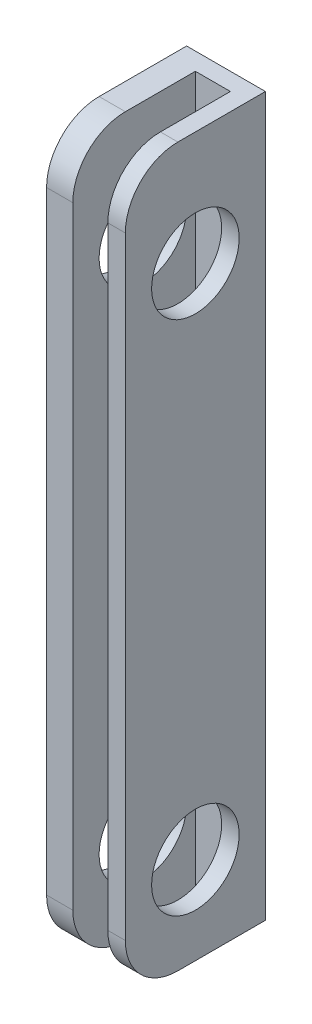
ISO-10303-21;
HEADER;
FILE_DESCRIPTION(('STEP AP214'),'2;1');
FILE_NAME('part.step','',(''),(''),'','','');
FILE_SCHEMA(('AUTOMOTIVE_DESIGN { 1 0 10303 214 1 1 1 1 }'));
ENDSEC;
DATA;
#1=APPLICATION_CONTEXT('core data for automotive mechanical design processes');
#2=APPLICATION_PROTOCOL_DEFINITION('international standard','automotive_design',2000,#1);
#3=PRODUCT_CONTEXT('',#1,'mechanical');
#4=PRODUCT('Part','Part','',(#3));
#5=PRODUCT_RELATED_PRODUCT_CATEGORY('part','',(#4));
#6=PRODUCT_DEFINITION_FORMATION('','',#4);
#7=PRODUCT_DEFINITION_CONTEXT('part definition',#1,'design');
#8=PRODUCT_DEFINITION('design','',#6,#7);
#9=PRODUCT_DEFINITION_SHAPE('','',#8);
#10=(LENGTH_UNIT() NAMED_UNIT(*) SI_UNIT(.MILLI.,.METRE.));
#11=(NAMED_UNIT(*) PLANE_ANGLE_UNIT() SI_UNIT($,.RADIAN.));
#12=(NAMED_UNIT(*) SI_UNIT($,.STERADIAN.) SOLID_ANGLE_UNIT());
#13=UNCERTAINTY_MEASURE_WITH_UNIT(LENGTH_MEASURE(1.E-05),#10,'distance_accuracy_value','');
#14=(GEOMETRIC_REPRESENTATION_CONTEXT(3) GLOBAL_UNCERTAINTY_ASSIGNED_CONTEXT((#13)) GLOBAL_UNIT_ASSIGNED_CONTEXT((#10,
#11,#12)) REPRESENTATION_CONTEXT('',''));
#15=CARTESIAN_POINT('',(0.,0.,0.));
#16=DIRECTION('',(0.,0.,1.));
#17=DIRECTION('',(1.,0.,0.));
#18=AXIS2_PLACEMENT_3D('',#15,#16,#17);
#19=CARTESIAN_POINT('',(0.,0.,8.));
#20=DIRECTION('',(0.,0.,1.));
#21=DIRECTION('',(1.,0.,0.));
#22=AXIS2_PLACEMENT_3D('',#19,#20,#21);
#23=PLANE('',#22);
#24=DIRECTION('',(0.,-1.,0.));
#25=VECTOR('',#24,1.);
#26=CARTESIAN_POINT('',(-2.25,20.5,8.));
#27=LINE('',#26,#25);
#28=CARTESIAN_POINT('',(-2.25,17.5,8.));
#29=VERTEX_POINT('',#28);
#30=CARTESIAN_POINT('',(-2.25,-17.5,8.));
#31=VERTEX_POINT('',#30);
#32=EDGE_CURVE('E166',#29,#31,#27,.T.);
#33=ORIENTED_EDGE('',*,*,#32,.T.);
#34=DIRECTION('',(1.,0.,0.));
#35=VECTOR('',#34,1.);
#36=CARTESIAN_POINT('',(-0.749999999999997,-17.5,8.));
#37=LINE('',#36,#35);
#38=CARTESIAN_POINT('',(-0.749999999999998,-17.5,8.));
#39=VERTEX_POINT('',#38);
#40=EDGE_CURVE('E199',#31,#39,#37,.T.);
#41=ORIENTED_EDGE('',*,*,#40,.T.);
#42=DIRECTION('',(0.,-1.,0.));
#43=VECTOR('',#42,1.);
#44=CARTESIAN_POINT('',(-0.750000000000002,20.5,8.));
#45=LINE('',#44,#43);
#46=CARTESIAN_POINT('',(-0.750000000000002,17.5,8.));
#47=VERTEX_POINT('',#46);
#48=EDGE_CURVE('E153',#47,#39,#45,.T.);
#49=ORIENTED_EDGE('',*,*,#48,.F.);
#50=DIRECTION('',(-1.,0.,0.));
#51=VECTOR('',#50,1.);
#52=CARTESIAN_POINT('',(-2.25,17.5,8.));
#53=LINE('',#52,#51);
#54=EDGE_CURVE('E188',#47,#29,#53,.T.);
#55=ORIENTED_EDGE('',*,*,#54,.T.);
#56=EDGE_LOOP('',(#33,#41,#49,#55));
#57=FACE_BOUND('',#56,.T.);
#58=ADVANCED_FACE('F35',(#57),#23,.T.);
#59=CARTESIAN_POINT('',(2.25,20.5,8.));
#60=DIRECTION('',(-1.,0.,0.));
#61=DIRECTION('',(0.,-1.,0.));
#62=AXIS2_PLACEMENT_3D('',#59,#60,#61);
#63=PLANE('',#62);
#64=CARTESIAN_POINT('',(2.25,14.,4.));
#65=DIRECTION('',(1.,0.,0.));
#66=DIRECTION('',(0.,1.,0.));
#67=AXIS2_PLACEMENT_3D('',#64,#65,#66);
#68=CIRCLE('',#67,2.5);
#69=CARTESIAN_POINT('',(2.25,16.5,4.));
#70=VERTEX_POINT('',#69);
#71=EDGE_CURVE('E420',#70,#70,#68,.T.);
#72=ORIENTED_EDGE('',*,*,#71,.F.);
#73=EDGE_LOOP('',(#72));
#74=FACE_BOUND('',#73,.T.);
#75=CARTESIAN_POINT('',(2.25,-15.5,4.));
#76=DIRECTION('',(1.,0.,0.));
#77=DIRECTION('',(0.,1.,0.));
#78=AXIS2_PLACEMENT_3D('',#75,#76,#77);
#79=CIRCLE('',#78,2.5);
#80=CARTESIAN_POINT('',(2.25,-13.,4.));
#81=VERTEX_POINT('',#80);
#82=EDGE_CURVE('E414',#81,#81,#79,.T.);
#83=ORIENTED_EDGE('',*,*,#82,.F.);
#84=EDGE_LOOP('',(#83));
#85=FACE_BOUND('',#84,.T.);
#86=DIRECTION('',(0.,1.,0.));
#87=VECTOR('',#86,1.);
#88=CARTESIAN_POINT('',(2.25,20.5,8.));
#89=LINE('',#88,#87);
#90=CARTESIAN_POINT('',(2.25,-17.5,8.));
#91=VERTEX_POINT('',#90);
#92=CARTESIAN_POINT('',(2.25,17.5,8.));
#93=VERTEX_POINT('',#92);
#94=EDGE_CURVE('E163',#91,#93,#89,.T.);
#95=ORIENTED_EDGE('',*,*,#94,.F.);
#96=CARTESIAN_POINT('',(2.25,-17.5,5.));
#97=DIRECTION('',(-1.,0.,0.));
#98=DIRECTION('',(0.,-1.,0.));
#99=AXIS2_PLACEMENT_3D('',#96,#97,#98);
#100=CIRCLE('',#99,3.);
#101=CARTESIAN_POINT('',(2.25000000000001,-20.5,5.));
#102=VERTEX_POINT('',#101);
#103=EDGE_CURVE('E221',#91,#102,#100,.F.);
#104=ORIENTED_EDGE('',*,*,#103,.T.);
#105=DIRECTION('',(0.,0.,-1.));
#106=VECTOR('',#105,1.);
#107=CARTESIAN_POINT('',(2.25000000000001,-20.5,8.));
#108=LINE('',#107,#106);
#109=CARTESIAN_POINT('',(2.25000000000001,-20.5,0.));
#110=VERTEX_POINT('',#109);
#111=EDGE_CURVE('E170',#102,#110,#108,.T.);
#112=ORIENTED_EDGE('',*,*,#111,.T.);
#113=DIRECTION('',(0.,1.,0.));
#114=VECTOR('',#113,1.);
#115=CARTESIAN_POINT('',(2.25,20.5,0.));
#116=LINE('',#115,#114);
#117=CARTESIAN_POINT('',(2.25,20.5,0.));
#118=VERTEX_POINT('',#117);
#119=EDGE_CURVE('E159',#110,#118,#116,.T.);
#120=ORIENTED_EDGE('',*,*,#119,.T.);
#121=DIRECTION('',(0.,0.,-1.));
#122=VECTOR('',#121,1.);
#123=CARTESIAN_POINT('',(2.25,20.5,8.));
#124=LINE('',#123,#122);
#125=CARTESIAN_POINT('',(2.25,20.5,5.));
#126=VERTEX_POINT('',#125);
#127=EDGE_CURVE('E186',#126,#118,#124,.T.);
#128=ORIENTED_EDGE('',*,*,#127,.F.);
#129=CARTESIAN_POINT('',(2.25,17.5,5.));
#130=DIRECTION('',(-1.,0.,0.));
#131=DIRECTION('',(0.,-1.,0.));
#132=AXIS2_PLACEMENT_3D('',#129,#130,#131);
#133=CIRCLE('',#132,3.);
#134=EDGE_CURVE('E219',#126,#93,#133,.F.);
#135=ORIENTED_EDGE('',*,*,#134,.T.);
#136=EDGE_LOOP('',(#95,#104,#112,#120,#128,#135));
#137=FACE_BOUND('',#136,.T.);
#138=ADVANCED_FACE('F238',(#74,#85,#137),#63,.F.);
#139=CARTESIAN_POINT('',(-2.25,20.5,8.));
#140=DIRECTION('',(0.,-1.,0.));
#141=DIRECTION('',(0.,0.,-1.));
#142=AXIS2_PLACEMENT_3D('',#139,#140,#141);
#143=PLANE('',#142);
#144=DIRECTION('',(0.,0.,-1.));
#145=VECTOR('',#144,1.);
#146=CARTESIAN_POINT('',(-2.25,20.5,8.));
#147=LINE('',#146,#145);
#148=CARTESIAN_POINT('',(-2.25,20.5,5.));
#149=VERTEX_POINT('',#148);
#150=CARTESIAN_POINT('',(-2.25,20.5,0.));
#151=VERTEX_POINT('',#150);
#152=EDGE_CURVE('E184',#149,#151,#147,.T.);
#153=ORIENTED_EDGE('',*,*,#152,.F.);
#154=DIRECTION('',(-1.,0.,0.));
#155=VECTOR('',#154,1.);
#156=CARTESIAN_POINT('',(-0.750000000000002,20.5,5.));
#157=LINE('',#156,#155);
#158=CARTESIAN_POINT('',(-0.750000000000002,20.5,5.));
#159=VERTEX_POINT('',#158);
#160=EDGE_CURVE('E11',#149,#159,#157,.F.);
#161=ORIENTED_EDGE('',*,*,#160,.T.);
#162=DIRECTION('',(0.,0.,1.));
#163=VECTOR('',#162,1.);
#164=CARTESIAN_POINT('',(-0.750000000000002,20.5,1.));
#165=LINE('',#164,#163);
#166=CARTESIAN_POINT('',(-0.750000000000002,20.5,1.));
#167=VERTEX_POINT('',#166);
#168=EDGE_CURVE('E157',#167,#159,#165,.T.);
#169=ORIENTED_EDGE('',*,*,#168,.F.);
#170=DIRECTION('',(-1.,0.,0.));
#171=VECTOR('',#170,1.);
#172=CARTESIAN_POINT('',(-0.750000000000002,20.5,1.));
#173=LINE('',#172,#171);
#174=CARTESIAN_POINT('',(1.25,20.5,1.));
#175=VERTEX_POINT('',#174);
#176=EDGE_CURVE('E133',#175,#167,#173,.T.);
#177=ORIENTED_EDGE('',*,*,#176,.F.);
#178=DIRECTION('',(0.,0.,1.));
#179=VECTOR('',#178,1.);
#180=CARTESIAN_POINT('',(1.25,20.5,1.));
#181=LINE('',#180,#179);
#182=CARTESIAN_POINT('',(1.25,20.5,5.));
#183=VERTEX_POINT('',#182);
#184=EDGE_CURVE('E160',#175,#183,#181,.T.);
#185=ORIENTED_EDGE('',*,*,#184,.T.);
#186=DIRECTION('',(-1.,0.,0.));
#187=VECTOR('',#186,1.);
#188=CARTESIAN_POINT('',(2.25,20.5,5.));
#189=LINE('',#188,#187);
#190=EDGE_CURVE('E43',#183,#126,#189,.F.);
#191=ORIENTED_EDGE('',*,*,#190,.T.);
#192=ORIENTED_EDGE('',*,*,#127,.T.);
#193=DIRECTION('',(-1.,0.,0.));
#194=VECTOR('',#193,1.);
#195=CARTESIAN_POINT('',(-2.25,20.5,0.));
#196=LINE('',#195,#194);
#197=EDGE_CURVE('E173',#118,#151,#196,.T.);
#198=ORIENTED_EDGE('',*,*,#197,.T.);
#199=EDGE_LOOP('',(#153,#161,#169,#177,#185,#191,#192,#198));
#200=FACE_BOUND('',#199,.T.);
#201=ADVANCED_FACE('F260',(#200),#143,.F.);
#202=CARTESIAN_POINT('',(-2.25,20.5,8.));
#203=DIRECTION('',(1.,0.,0.));
#204=DIRECTION('',(0.,1.,0.));
#205=AXIS2_PLACEMENT_3D('',#202,#203,#204);
#206=PLANE('',#205);
#207=CARTESIAN_POINT('',(-2.25000000000001,14.,4.));
#208=DIRECTION('',(1.,0.,0.));
#209=DIRECTION('',(0.,1.,0.));
#210=AXIS2_PLACEMENT_3D('',#207,#208,#209);
#211=CIRCLE('',#210,2.5);
#212=CARTESIAN_POINT('',(-2.25000000000001,16.5,4.));
#213=VERTEX_POINT('',#212);
#214=EDGE_CURVE('E193',#213,#213,#211,.T.);
#215=ORIENTED_EDGE('',*,*,#214,.T.);
#216=EDGE_LOOP('',(#215));
#217=FACE_BOUND('',#216,.T.);
#218=CARTESIAN_POINT('',(-2.25,-15.5,4.));
#219=DIRECTION('',(1.,0.,0.));
#220=DIRECTION('',(0.,1.,0.));
#221=AXIS2_PLACEMENT_3D('',#218,#219,#220);
#222=CIRCLE('',#221,2.5);
#223=CARTESIAN_POINT('',(-2.25,-13.,4.));
#224=VERTEX_POINT('',#223);
#225=EDGE_CURVE('E417',#224,#224,#222,.T.);
#226=ORIENTED_EDGE('',*,*,#225,.T.);
#227=EDGE_LOOP('',(#226));
#228=FACE_BOUND('',#227,.T.);
#229=DIRECTION('',(0.,0.,-1.));
#230=VECTOR('',#229,1.);
#231=CARTESIAN_POINT('',(-2.25,-20.5,8.));
#232=LINE('',#231,#230);
#233=CARTESIAN_POINT('',(-2.25,-20.5,5.));
#234=VERTEX_POINT('',#233);
#235=CARTESIAN_POINT('',(-2.25,-20.5,0.));
#236=VERTEX_POINT('',#235);
#237=EDGE_CURVE('E182',#234,#236,#232,.T.);
#238=ORIENTED_EDGE('',*,*,#237,.F.);
#239=CARTESIAN_POINT('',(-2.25,-17.5,5.));
#240=DIRECTION('',(1.,0.,0.));
#241=DIRECTION('',(0.,1.,0.));
#242=AXIS2_PLACEMENT_3D('',#239,#240,#241);
#243=CIRCLE('',#242,3.);
#244=EDGE_CURVE('E211',#234,#31,#243,.F.);
#245=ORIENTED_EDGE('',*,*,#244,.T.);
#246=ORIENTED_EDGE('',*,*,#32,.F.);
#247=CARTESIAN_POINT('',(-2.25,17.5,5.));
#248=DIRECTION('',(1.,0.,0.));
#249=DIRECTION('',(0.,1.,0.));
#250=AXIS2_PLACEMENT_3D('',#247,#248,#249);
#251=CIRCLE('',#250,3.);
#252=EDGE_CURVE('E209',#29,#149,#251,.F.);
#253=ORIENTED_EDGE('',*,*,#252,.T.);
#254=ORIENTED_EDGE('',*,*,#152,.T.);
#255=DIRECTION('',(0.,-1.,0.));
#256=VECTOR('',#255,1.);
#257=CARTESIAN_POINT('',(-2.25,20.5,0.));
#258=LINE('',#257,#256);
#259=EDGE_CURVE('E176',#151,#236,#258,.T.);
#260=ORIENTED_EDGE('',*,*,#259,.T.);
#261=EDGE_LOOP('',(#238,#245,#246,#253,#254,#260));
#262=FACE_BOUND('',#261,.T.);
#263=ADVANCED_FACE('F270',(#217,#228,#262),#206,.F.);
#264=CARTESIAN_POINT('',(-2.25,-20.5,8.));
#265=DIRECTION('',(0.,1.,0.));
#266=DIRECTION('',(0.,0.,1.));
#267=AXIS2_PLACEMENT_3D('',#264,#265,#266);
#268=PLANE('',#267);
#269=DIRECTION('',(0.,0.,1.));
#270=VECTOR('',#269,1.);
#271=CARTESIAN_POINT('',(-0.749999999999997,-20.5,1.));
#272=LINE('',#271,#270);
#273=CARTESIAN_POINT('',(-0.749999999999997,-20.5,1.));
#274=VERTEX_POINT('',#273);
#275=CARTESIAN_POINT('',(-0.749999999999997,-20.5,5.));
#276=VERTEX_POINT('',#275);
#277=EDGE_CURVE('E121',#274,#276,#272,.T.);
#278=ORIENTED_EDGE('',*,*,#277,.T.);
#279=DIRECTION('',(1.,0.,0.));
#280=VECTOR('',#279,1.);
#281=CARTESIAN_POINT('',(-2.25,-20.5,5.));
#282=LINE('',#281,#280);
#283=EDGE_CURVE('E207',#276,#234,#282,.F.);
#284=ORIENTED_EDGE('',*,*,#283,.T.);
#285=ORIENTED_EDGE('',*,*,#237,.T.);
#286=DIRECTION('',(1.,0.,0.));
#287=VECTOR('',#286,1.);
#288=CARTESIAN_POINT('',(-2.25,-20.5,0.));
#289=LINE('',#288,#287);
#290=EDGE_CURVE('E167',#236,#110,#289,.T.);
#291=ORIENTED_EDGE('',*,*,#290,.T.);
#292=ORIENTED_EDGE('',*,*,#111,.F.);
#293=DIRECTION('',(1.,0.,0.));
#294=VECTOR('',#293,1.);
#295=CARTESIAN_POINT('',(1.25,-20.5,5.));
#296=LINE('',#295,#294);
#297=CARTESIAN_POINT('',(1.25,-20.5,5.));
#298=VERTEX_POINT('',#297);
#299=EDGE_CURVE('E205',#102,#298,#296,.F.);
#300=ORIENTED_EDGE('',*,*,#299,.T.);
#301=DIRECTION('',(0.,0.,1.));
#302=VECTOR('',#301,1.);
#303=CARTESIAN_POINT('',(1.25,-20.5,1.));
#304=LINE('',#303,#302);
#305=CARTESIAN_POINT('',(1.25,-20.5,1.));
#306=VERTEX_POINT('',#305);
#307=EDGE_CURVE('E132',#306,#298,#304,.T.);
#308=ORIENTED_EDGE('',*,*,#307,.F.);
#309=DIRECTION('',(1.,0.,0.));
#310=VECTOR('',#309,1.);
#311=CARTESIAN_POINT('',(-0.749999999999997,-20.5,1.));
#312=LINE('',#311,#310);
#313=EDGE_CURVE('E139',#274,#306,#312,.T.);
#314=ORIENTED_EDGE('',*,*,#313,.F.);
#315=EDGE_LOOP('',(#278,#284,#285,#291,#292,#300,#308,#314));
#316=FACE_BOUND('',#315,.T.);
#317=ADVANCED_FACE('F145',(#316),#268,.F.);
#318=DIRECTION('',(0.,1.,0.));
#319=VECTOR('',#318,1.);
#320=CARTESIAN_POINT('',(1.25,20.5,8.));
#321=LINE('',#320,#319);
#322=CARTESIAN_POINT('',(1.25,-17.5,8.));
#323=VERTEX_POINT('',#322);
#324=CARTESIAN_POINT('',(1.25,17.5,8.));
#325=VERTEX_POINT('',#324);
#326=EDGE_CURVE('E143',#323,#325,#321,.T.);
#327=ORIENTED_EDGE('',*,*,#326,.F.);
#328=DIRECTION('',(1.,0.,0.));
#329=VECTOR('',#328,1.);
#330=CARTESIAN_POINT('',(2.25000000000001,-17.5,8.));
#331=LINE('',#330,#329);
#332=EDGE_CURVE('E216',#323,#91,#331,.T.);
#333=ORIENTED_EDGE('',*,*,#332,.T.);
#334=ORIENTED_EDGE('',*,*,#94,.T.);
#335=DIRECTION('',(-1.,0.,0.));
#336=VECTOR('',#335,1.);
#337=CARTESIAN_POINT('',(1.25,17.5,8.));
#338=LINE('',#337,#336);
#339=EDGE_CURVE('E213',#93,#325,#338,.T.);
#340=ORIENTED_EDGE('',*,*,#339,.T.);
#341=EDGE_LOOP('',(#327,#333,#334,#340));
#342=FACE_BOUND('',#341,.T.);
#343=ADVANCED_FACE('F232',(#342),#23,.T.);
#344=CARTESIAN_POINT('',(0.,0.,0.));
#345=DIRECTION('',(0.,0.,1.));
#346=DIRECTION('',(1.,0.,0.));
#347=AXIS2_PLACEMENT_3D('',#344,#345,#346);
#348=PLANE('',#347);
#349=ORIENTED_EDGE('',*,*,#119,.F.);
#350=ORIENTED_EDGE('',*,*,#290,.F.);
#351=ORIENTED_EDGE('',*,*,#259,.F.);
#352=ORIENTED_EDGE('',*,*,#197,.F.);
#353=EDGE_LOOP('',(#349,#350,#351,#352));
#354=FACE_BOUND('',#353,.T.);
#355=ADVANCED_FACE('F245',(#354),#348,.F.);
#356=CARTESIAN_POINT('',(-0.750000000000002,20.5,1.));
#357=DIRECTION('',(-1.,0.,0.));
#358=DIRECTION('',(0.,-1.,0.));
#359=AXIS2_PLACEMENT_3D('',#356,#357,#358);
#360=PLANE('',#359);
#361=CARTESIAN_POINT('',(-0.750000000000001,14.,4.));
#362=DIRECTION('',(-1.,0.,0.));
#363=DIRECTION('',(0.,-1.,0.));
#364=AXIS2_PLACEMENT_3D('',#361,#362,#363);
#365=CIRCLE('',#364,2.5);
#366=CARTESIAN_POINT('',(-0.750000000000001,11.5,4.));
#367=VERTEX_POINT('',#366);
#368=EDGE_CURVE('E155',#367,#367,#365,.T.);
#369=ORIENTED_EDGE('',*,*,#368,.T.);
#370=EDGE_LOOP('',(#369));
#371=FACE_BOUND('',#370,.T.);
#372=CARTESIAN_POINT('',(-0.749999999999998,-15.5,4.));
#373=DIRECTION('',(-1.,0.,0.));
#374=DIRECTION('',(0.,-1.,0.));
#375=AXIS2_PLACEMENT_3D('',#372,#373,#374);
#376=CIRCLE('',#375,2.5);
#377=CARTESIAN_POINT('',(-0.749999999999998,-18.,4.));
#378=VERTEX_POINT('',#377);
#379=EDGE_CURVE('E192',#378,#378,#376,.T.);
#380=ORIENTED_EDGE('',*,*,#379,.T.);
#381=EDGE_LOOP('',(#380));
#382=FACE_BOUND('',#381,.T.);
#383=ORIENTED_EDGE('',*,*,#48,.T.);
#384=CARTESIAN_POINT('',(-0.749999999999998,-17.5,5.));
#385=DIRECTION('',(-1.,0.,0.));
#386=DIRECTION('',(0.,-1.,0.));
#387=AXIS2_PLACEMENT_3D('',#384,#385,#386);
#388=CIRCLE('',#387,3.);
#389=EDGE_CURVE('E128',#39,#276,#388,.F.);
#390=ORIENTED_EDGE('',*,*,#389,.T.);
#391=ORIENTED_EDGE('',*,*,#277,.F.);
#392=DIRECTION('',(0.,-1.,0.));
#393=VECTOR('',#392,1.);
#394=CARTESIAN_POINT('',(-0.750000000000002,20.5,1.));
#395=LINE('',#394,#393);
#396=EDGE_CURVE('E126',#167,#274,#395,.T.);
#397=ORIENTED_EDGE('',*,*,#396,.F.);
#398=ORIENTED_EDGE('',*,*,#168,.T.);
#399=CARTESIAN_POINT('',(-0.750000000000002,17.5,5.));
#400=DIRECTION('',(-1.,0.,0.));
#401=DIRECTION('',(0.,-1.,0.));
#402=AXIS2_PLACEMENT_3D('',#399,#400,#401);
#403=CIRCLE('',#402,3.);
#404=EDGE_CURVE('E202',#159,#47,#403,.F.);
#405=ORIENTED_EDGE('',*,*,#404,.T.);
#406=EDGE_LOOP('',(#383,#390,#391,#397,#398,#405));
#407=FACE_BOUND('',#406,.T.);
#408=ADVANCED_FACE('F124',(#371,#382,#407),#360,.F.);
#409=CARTESIAN_POINT('',(1.25,20.5,1.));
#410=DIRECTION('',(1.,0.,0.));
#411=DIRECTION('',(0.,1.,0.));
#412=AXIS2_PLACEMENT_3D('',#409,#410,#411);
#413=PLANE('',#412);
#414=CARTESIAN_POINT('',(1.25,14.,4.));
#415=DIRECTION('',(1.,0.,0.));
#416=DIRECTION('',(0.,1.,0.));
#417=AXIS2_PLACEMENT_3D('',#414,#415,#416);
#418=CIRCLE('',#417,2.5);
#419=CARTESIAN_POINT('',(1.25,16.5,4.));
#420=VERTEX_POINT('',#419);
#421=EDGE_CURVE('E194',#420,#420,#418,.T.);
#422=ORIENTED_EDGE('',*,*,#421,.T.);
#423=EDGE_LOOP('',(#422));
#424=FACE_BOUND('',#423,.T.);
#425=CARTESIAN_POINT('',(1.25,-15.5,4.));
#426=DIRECTION('',(1.,0.,0.));
#427=DIRECTION('',(0.,1.,0.));
#428=AXIS2_PLACEMENT_3D('',#425,#426,#427);
#429=CIRCLE('',#428,2.5);
#430=CARTESIAN_POINT('',(1.25,-13.,4.));
#431=VERTEX_POINT('',#430);
#432=EDGE_CURVE('E189',#431,#431,#429,.T.);
#433=ORIENTED_EDGE('',*,*,#432,.T.);
#434=EDGE_LOOP('',(#433));
#435=FACE_BOUND('',#434,.T.);
#436=ORIENTED_EDGE('',*,*,#307,.T.);
#437=CARTESIAN_POINT('',(1.25,-17.5,5.));
#438=DIRECTION('',(1.,0.,0.));
#439=DIRECTION('',(0.,1.,0.));
#440=AXIS2_PLACEMENT_3D('',#437,#438,#439);
#441=CIRCLE('',#440,3.);
#442=EDGE_CURVE('E224',#298,#323,#441,.F.);
#443=ORIENTED_EDGE('',*,*,#442,.T.);
#444=ORIENTED_EDGE('',*,*,#326,.T.);
#445=CARTESIAN_POINT('',(1.25,17.5,5.));
#446=DIRECTION('',(1.,0.,0.));
#447=DIRECTION('',(0.,1.,0.));
#448=AXIS2_PLACEMENT_3D('',#445,#446,#447);
#449=CIRCLE('',#448,3.);
#450=EDGE_CURVE('E50',#325,#183,#449,.F.);
#451=ORIENTED_EDGE('',*,*,#450,.T.);
#452=ORIENTED_EDGE('',*,*,#184,.F.);
#453=DIRECTION('',(0.,1.,0.));
#454=VECTOR('',#453,1.);
#455=CARTESIAN_POINT('',(1.25,20.5,1.));
#456=LINE('',#455,#454);
#457=EDGE_CURVE('E147',#306,#175,#456,.T.);
#458=ORIENTED_EDGE('',*,*,#457,.F.);
#459=EDGE_LOOP('',(#436,#443,#444,#451,#452,#458));
#460=FACE_BOUND('',#459,.T.);
#461=ADVANCED_FACE('F227',(#424,#435,#460),#413,.F.);
#462=CARTESIAN_POINT('',(0.,0.,1.));
#463=DIRECTION('',(0.,0.,1.));
#464=DIRECTION('',(1.,0.,0.));
#465=AXIS2_PLACEMENT_3D('',#462,#463,#464);
#466=PLANE('',#465);
#467=ORIENTED_EDGE('',*,*,#396,.T.);
#468=ORIENTED_EDGE('',*,*,#313,.T.);
#469=ORIENTED_EDGE('',*,*,#457,.T.);
#470=ORIENTED_EDGE('',*,*,#176,.T.);
#471=EDGE_LOOP('',(#467,#468,#469,#470));
#472=FACE_BOUND('',#471,.T.);
#473=ADVANCED_FACE('F137',(#472),#466,.T.);
#474=CARTESIAN_POINT('',(-2.25,-15.5,4.));
#475=DIRECTION('',(1.,0.,0.));
#476=DIRECTION('',(0.,1.,0.));
#477=AXIS2_PLACEMENT_3D('',#474,#475,#476);
#478=CYLINDRICAL_SURFACE('',#477,2.5);
#479=ORIENTED_EDGE('',*,*,#82,.T.);
#480=EDGE_LOOP('',(#479));
#481=FACE_BOUND('',#480,.T.);
#482=ORIENTED_EDGE('',*,*,#432,.F.);
#483=EDGE_LOOP('',(#482));
#484=FACE_BOUND('',#483,.T.);
#485=ADVANCED_FACE('F327',(#481,#484),#478,.F.);
#486=CARTESIAN_POINT('',(-2.25000000000001,14.,4.));
#487=DIRECTION('',(1.,0.,0.));
#488=DIRECTION('',(0.,1.,0.));
#489=AXIS2_PLACEMENT_3D('',#486,#487,#488);
#490=CYLINDRICAL_SURFACE('',#489,2.5);
#491=ORIENTED_EDGE('',*,*,#71,.T.);
#492=EDGE_LOOP('',(#491));
#493=FACE_BOUND('',#492,.T.);
#494=ORIENTED_EDGE('',*,*,#421,.F.);
#495=EDGE_LOOP('',(#494));
#496=FACE_BOUND('',#495,.T.);
#497=ADVANCED_FACE('F318',(#493,#496),#490,.F.);
#498=ORIENTED_EDGE('',*,*,#225,.F.);
#499=EDGE_LOOP('',(#498));
#500=FACE_BOUND('',#499,.T.);
#501=ORIENTED_EDGE('',*,*,#379,.F.);
#502=EDGE_LOOP('',(#501));
#503=FACE_BOUND('',#502,.T.);
#504=ADVANCED_FACE('F315',(#500,#503),#478,.F.);
#505=ORIENTED_EDGE('',*,*,#214,.F.);
#506=EDGE_LOOP('',(#505));
#507=FACE_BOUND('',#506,.T.);
#508=ORIENTED_EDGE('',*,*,#368,.F.);
#509=EDGE_LOOP('',(#508));
#510=FACE_BOUND('',#509,.T.);
#511=ADVANCED_FACE('F283',(#507,#510),#490,.F.);
#512=CARTESIAN_POINT('',(0.,-17.5,5.));
#513=DIRECTION('',(-1.,0.,0.));
#514=DIRECTION('',(0.,0.,1.));
#515=AXIS2_PLACEMENT_3D('',#512,#513,#514);
#516=CYLINDRICAL_SURFACE('',#515,3.);
#517=ORIENTED_EDGE('',*,*,#244,.F.);
#518=ORIENTED_EDGE('',*,*,#283,.F.);
#519=ORIENTED_EDGE('',*,*,#389,.F.);
#520=ORIENTED_EDGE('',*,*,#40,.F.);
#521=EDGE_LOOP('',(#517,#518,#519,#520));
#522=FACE_BOUND('',#521,.T.);
#523=ADVANCED_FACE('F280',(#522),#516,.T.);
#524=CARTESIAN_POINT('',(0.,-17.5,5.));
#525=DIRECTION('',(-1.,0.,0.));
#526=DIRECTION('',(0.,0.,1.));
#527=AXIS2_PLACEMENT_3D('',#524,#525,#526);
#528=CYLINDRICAL_SURFACE('',#527,3.);
#529=ORIENTED_EDGE('',*,*,#442,.F.);
#530=ORIENTED_EDGE('',*,*,#299,.F.);
#531=ORIENTED_EDGE('',*,*,#103,.F.);
#532=ORIENTED_EDGE('',*,*,#332,.F.);
#533=EDGE_LOOP('',(#529,#530,#531,#532));
#534=FACE_BOUND('',#533,.T.);
#535=ADVANCED_FACE('F235',(#534),#528,.T.);
#536=CARTESIAN_POINT('',(0.,17.5,5.));
#537=DIRECTION('',(1.,0.,0.));
#538=DIRECTION('',(0.,0.,-1.));
#539=AXIS2_PLACEMENT_3D('',#536,#537,#538);
#540=CYLINDRICAL_SURFACE('',#539,3.);
#541=ORIENTED_EDGE('',*,*,#404,.F.);
#542=ORIENTED_EDGE('',*,*,#160,.F.);
#543=ORIENTED_EDGE('',*,*,#252,.F.);
#544=ORIENTED_EDGE('',*,*,#54,.F.);
#545=EDGE_LOOP('',(#541,#542,#543,#544));
#546=FACE_BOUND('',#545,.T.);
#547=ADVANCED_FACE('F249',(#546),#540,.T.);
#548=CARTESIAN_POINT('',(0.,17.5,5.));
#549=DIRECTION('',(1.,0.,0.));
#550=DIRECTION('',(0.,0.,-1.));
#551=AXIS2_PLACEMENT_3D('',#548,#549,#550);
#552=CYLINDRICAL_SURFACE('',#551,3.);
#553=ORIENTED_EDGE('',*,*,#134,.F.);
#554=ORIENTED_EDGE('',*,*,#190,.F.);
#555=ORIENTED_EDGE('',*,*,#450,.F.);
#556=ORIENTED_EDGE('',*,*,#339,.F.);
#557=EDGE_LOOP('',(#553,#554,#555,#556));
#558=FACE_BOUND('',#557,.T.);
#559=ADVANCED_FACE('F37',(#558),#552,.T.);
#560=CLOSED_SHELL('',(#58,#138,#201,#263,#317,#343,#355,#408,#461,#473,#485,#497,#504,#511,#523,
#535,#547,#559));
#561=MANIFOLD_SOLID_BREP('B2',#560);
#562=ADVANCED_BREP_SHAPE_REPRESENTATION('',(#18,#561),#14);
#563=SHAPE_DEFINITION_REPRESENTATION(#9,#562);
ENDSEC;
END-ISO-10303-21;
